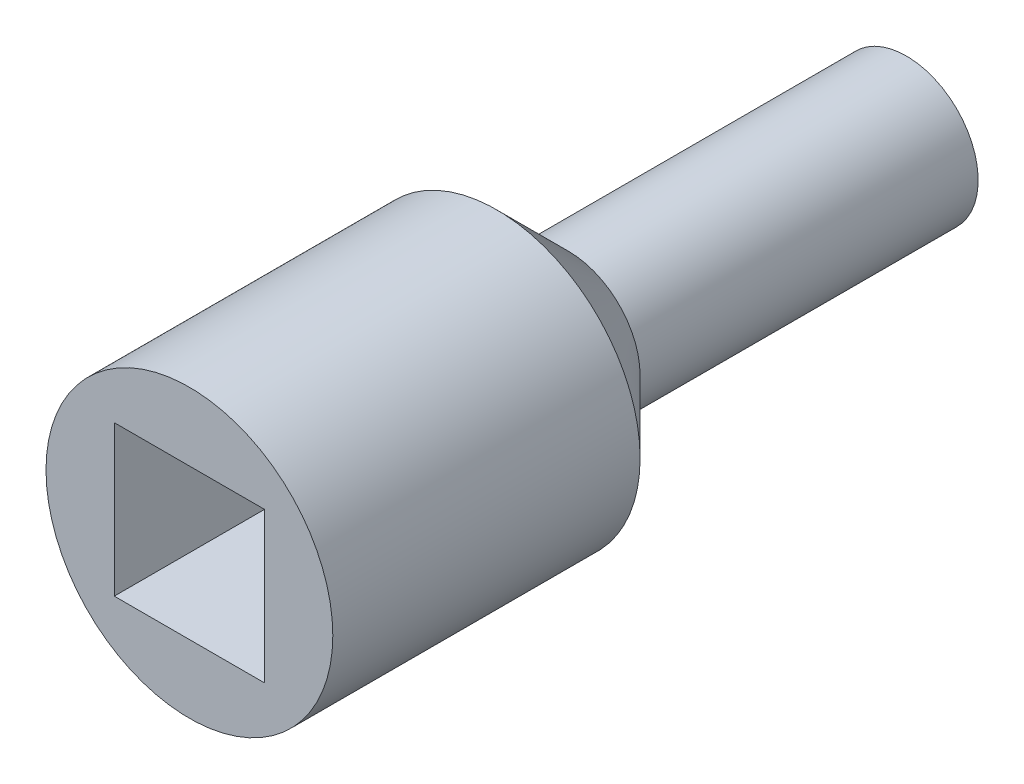
ISO-10303-21;
HEADER;
FILE_DESCRIPTION(('STEP AP214'),'2;1');
FILE_NAME('part.step','',(''),(''),'','','');
FILE_SCHEMA(('AUTOMOTIVE_DESIGN { 1 0 10303 214 1 1 1 1 }'));
ENDSEC;
DATA;
#1=APPLICATION_CONTEXT('core data for automotive mechanical design processes');
#2=APPLICATION_PROTOCOL_DEFINITION('international standard','automotive_design',2000,#1);
#3=PRODUCT_CONTEXT('',#1,'mechanical');
#4=PRODUCT('Part','Part','',(#3));
#5=PRODUCT_RELATED_PRODUCT_CATEGORY('part','',(#4));
#6=PRODUCT_DEFINITION_FORMATION('','',#4);
#7=PRODUCT_DEFINITION_CONTEXT('part definition',#1,'design');
#8=PRODUCT_DEFINITION('design','',#6,#7);
#9=PRODUCT_DEFINITION_SHAPE('','',#8);
#10=(LENGTH_UNIT() NAMED_UNIT(*) SI_UNIT(.MILLI.,.METRE.));
#11=(NAMED_UNIT(*) PLANE_ANGLE_UNIT() SI_UNIT($,.RADIAN.));
#12=(NAMED_UNIT(*) SI_UNIT($,.STERADIAN.) SOLID_ANGLE_UNIT());
#13=UNCERTAINTY_MEASURE_WITH_UNIT(LENGTH_MEASURE(1.E-05),#10,'distance_accuracy_value','');
#14=(GEOMETRIC_REPRESENTATION_CONTEXT(3) GLOBAL_UNCERTAINTY_ASSIGNED_CONTEXT((#13)) GLOBAL_UNIT_ASSIGNED_CONTEXT((#10,
#11,#12)) REPRESENTATION_CONTEXT('',''));
#15=CARTESIAN_POINT('',(0.,0.,0.));
#16=DIRECTION('',(0.,0.,1.));
#17=DIRECTION('',(1.,0.,0.));
#18=AXIS2_PLACEMENT_3D('',#15,#16,#17);
#19=CARTESIAN_POINT('',(0.,0.,10.));
#20=DIRECTION('',(0.,0.,-1.));
#21=DIRECTION('',(-1.,0.,0.));
#22=AXIS2_PLACEMENT_3D('',#19,#20,#21);
#23=CYLINDRICAL_SURFACE('',#22,3.5);
#24=CARTESIAN_POINT('',(0.,0.,17.5));
#25=DIRECTION('',(0.,0.,1.));
#26=DIRECTION('',(1.,0.,0.));
#27=AXIS2_PLACEMENT_3D('',#24,#25,#26);
#28=CIRCLE('',#27,3.5);
#29=CARTESIAN_POINT('',(3.5,0.,17.5));
#30=VERTEX_POINT('',#29);
#31=EDGE_CURVE('E11',#30,#30,#28,.T.);
#32=ORIENTED_EDGE('',*,*,#31,.F.);
#33=EDGE_LOOP('',(#32));
#34=FACE_BOUND('',#33,.T.);
#35=CARTESIAN_POINT('',(0.,0.,10.));
#36=DIRECTION('',(0.,0.,-1.));
#37=DIRECTION('',(-1.,0.,0.));
#38=AXIS2_PLACEMENT_3D('',#35,#36,#37);
#39=CIRCLE('',#38,3.5);
#40=CARTESIAN_POINT('',(-3.5,0.,10.));
#41=VERTEX_POINT('',#40);
#42=EDGE_CURVE('E109',#41,#41,#39,.T.);
#43=ORIENTED_EDGE('',*,*,#42,.F.);
#44=EDGE_LOOP('',(#43));
#45=FACE_BOUND('',#44,.T.);
#46=ADVANCED_FACE('F39',(#34,#45),#23,.T.);
#47=CARTESIAN_POINT('',(0.,0.,17.5));
#48=DIRECTION('',(0.,0.,1.));
#49=DIRECTION('',(1.,0.,0.));
#50=AXIS2_PLACEMENT_3D('',#47,#48,#49);
#51=PLANE('',#50);
#52=DIRECTION('',(0.,1.,0.));
#53=VECTOR('',#52,1.);
#54=CARTESIAN_POINT('',(1.833798025,-1.833784525,17.5));
#55=LINE('',#54,#53);
#56=CARTESIAN_POINT('',(1.833798025,-1.833784525,17.5));
#57=VERTEX_POINT('',#56);
#58=CARTESIAN_POINT('',(1.833798025,1.833784525,17.5));
#59=VERTEX_POINT('',#58);
#60=EDGE_CURVE('E53',#57,#59,#55,.T.);
#61=ORIENTED_EDGE('',*,*,#60,.F.);
#62=DIRECTION('',(1.,0.,0.));
#63=VECTOR('',#62,1.);
#64=CARTESIAN_POINT('',(-1.833798025,-1.833784525,17.5));
#65=LINE('',#64,#63);
#66=CARTESIAN_POINT('',(-1.833798025,-1.833784525,17.5));
#67=VERTEX_POINT('',#66);
#68=EDGE_CURVE('E103',#67,#57,#65,.T.);
#69=ORIENTED_EDGE('',*,*,#68,.F.);
#70=DIRECTION('',(0.,-1.,0.));
#71=VECTOR('',#70,1.);
#72=CARTESIAN_POINT('',(-1.833798025,-1.833784525,17.5));
#73=LINE('',#72,#71);
#74=CARTESIAN_POINT('',(-1.833798025,1.833784525,17.5));
#75=VERTEX_POINT('',#74);
#76=EDGE_CURVE('E111',#75,#67,#73,.T.);
#77=ORIENTED_EDGE('',*,*,#76,.F.);
#78=DIRECTION('',(-1.,0.,0.));
#79=VECTOR('',#78,1.);
#80=CARTESIAN_POINT('',(-1.833798025,1.833784525,17.5));
#81=LINE('',#80,#79);
#82=EDGE_CURVE('E87',#59,#75,#81,.T.);
#83=ORIENTED_EDGE('',*,*,#82,.F.);
#84=EDGE_LOOP('',(#61,#69,#77,#83));
#85=FACE_BOUND('',#84,.T.);
#86=ORIENTED_EDGE('',*,*,#31,.T.);
#87=EDGE_LOOP('',(#86));
#88=FACE_BOUND('',#87,.T.);
#89=ADVANCED_FACE('F116',(#85,#88),#51,.T.);
#90=CARTESIAN_POINT('',(1.833798025,-1.833784525,12.5));
#91=DIRECTION('',(1.,0.,0.));
#92=DIRECTION('',(0.,0.,-1.));
#93=AXIS2_PLACEMENT_3D('',#90,#91,#92);
#94=PLANE('',#93);
#95=ORIENTED_EDGE('',*,*,#60,.T.);
#96=DIRECTION('',(0.,0.,1.));
#97=VECTOR('',#96,1.);
#98=CARTESIAN_POINT('',(1.833798025,1.833784525,12.5));
#99=LINE('',#98,#97);
#100=CARTESIAN_POINT('',(1.833798025,1.833784525,12.5));
#101=VERTEX_POINT('',#100);
#102=EDGE_CURVE('E75',#101,#59,#99,.T.);
#103=ORIENTED_EDGE('',*,*,#102,.F.);
#104=DIRECTION('',(0.,1.,0.));
#105=VECTOR('',#104,1.);
#106=CARTESIAN_POINT('',(1.833798025,-1.833784525,12.5));
#107=LINE('',#106,#105);
#108=CARTESIAN_POINT('',(1.833798025,-1.833784525,12.5));
#109=VERTEX_POINT('',#108);
#110=EDGE_CURVE('E101',#109,#101,#107,.T.);
#111=ORIENTED_EDGE('',*,*,#110,.F.);
#112=DIRECTION('',(0.,0.,1.));
#113=VECTOR('',#112,1.);
#114=CARTESIAN_POINT('',(1.833798025,-1.833784525,12.5));
#115=LINE('',#114,#113);
#116=EDGE_CURVE('E46',#109,#57,#115,.T.);
#117=ORIENTED_EDGE('',*,*,#116,.T.);
#118=EDGE_LOOP('',(#95,#103,#111,#117));
#119=FACE_BOUND('',#118,.T.);
#120=ADVANCED_FACE('F121',(#119),#94,.F.);
#121=CARTESIAN_POINT('',(-1.833798025,-1.833784525,12.5));
#122=DIRECTION('',(0.,-1.,0.));
#123=DIRECTION('',(0.,0.,-1.));
#124=AXIS2_PLACEMENT_3D('',#121,#122,#123);
#125=PLANE('',#124);
#126=ORIENTED_EDGE('',*,*,#68,.T.);
#127=ORIENTED_EDGE('',*,*,#116,.F.);
#128=DIRECTION('',(1.,0.,0.));
#129=VECTOR('',#128,1.);
#130=CARTESIAN_POINT('',(-1.833798025,-1.833784525,12.5));
#131=LINE('',#130,#129);
#132=CARTESIAN_POINT('',(-1.833798025,-1.833784525,12.5));
#133=VERTEX_POINT('',#132);
#134=EDGE_CURVE('E98',#133,#109,#131,.T.);
#135=ORIENTED_EDGE('',*,*,#134,.F.);
#136=DIRECTION('',(0.,0.,1.));
#137=VECTOR('',#136,1.);
#138=CARTESIAN_POINT('',(-1.833798025,-1.833784525,12.5));
#139=LINE('',#138,#137);
#140=EDGE_CURVE('E91',#133,#67,#139,.T.);
#141=ORIENTED_EDGE('',*,*,#140,.T.);
#142=EDGE_LOOP('',(#126,#127,#135,#141));
#143=FACE_BOUND('',#142,.T.);
#144=ADVANCED_FACE('F119',(#143),#125,.F.);
#145=CARTESIAN_POINT('',(-1.833798025,-1.833784525,12.5));
#146=DIRECTION('',(-1.,0.,0.));
#147=DIRECTION('',(0.,0.,1.));
#148=AXIS2_PLACEMENT_3D('',#145,#146,#147);
#149=PLANE('',#148);
#150=ORIENTED_EDGE('',*,*,#76,.T.);
#151=ORIENTED_EDGE('',*,*,#140,.F.);
#152=DIRECTION('',(0.,-1.,0.));
#153=VECTOR('',#152,1.);
#154=CARTESIAN_POINT('',(-1.833798025,-1.833784525,12.5));
#155=LINE('',#154,#153);
#156=CARTESIAN_POINT('',(-1.833798025,1.833784525,12.5));
#157=VERTEX_POINT('',#156);
#158=EDGE_CURVE('E94',#157,#133,#155,.T.);
#159=ORIENTED_EDGE('',*,*,#158,.F.);
#160=DIRECTION('',(0.,0.,1.));
#161=VECTOR('',#160,1.);
#162=CARTESIAN_POINT('',(-1.833798025,1.833784525,12.5));
#163=LINE('',#162,#161);
#164=EDGE_CURVE('E80',#157,#75,#163,.T.);
#165=ORIENTED_EDGE('',*,*,#164,.T.);
#166=EDGE_LOOP('',(#150,#151,#159,#165));
#167=FACE_BOUND('',#166,.T.);
#168=ADVANCED_FACE('F95',(#167),#149,.F.);
#169=CARTESIAN_POINT('',(-1.833798025,1.833784525,12.5));
#170=DIRECTION('',(0.,1.,0.));
#171=DIRECTION('',(0.,0.,1.));
#172=AXIS2_PLACEMENT_3D('',#169,#170,#171);
#173=PLANE('',#172);
#174=ORIENTED_EDGE('',*,*,#82,.T.);
#175=ORIENTED_EDGE('',*,*,#164,.F.);
#176=DIRECTION('',(-1.,0.,0.));
#177=VECTOR('',#176,1.);
#178=CARTESIAN_POINT('',(-1.833798025,1.833784525,12.5));
#179=LINE('',#178,#177);
#180=EDGE_CURVE('E84',#101,#157,#179,.T.);
#181=ORIENTED_EDGE('',*,*,#180,.F.);
#182=ORIENTED_EDGE('',*,*,#102,.T.);
#183=EDGE_LOOP('',(#174,#175,#181,#182));
#184=FACE_BOUND('',#183,.T.);
#185=ADVANCED_FACE('F82',(#184),#173,.F.);
#186=CARTESIAN_POINT('',(0.,0.,12.5));
#187=DIRECTION('',(0.,0.,-1.));
#188=DIRECTION('',(-1.,0.,0.));
#189=AXIS2_PLACEMENT_3D('',#186,#187,#188);
#190=PLANE('',#189);
#191=ORIENTED_EDGE('',*,*,#110,.T.);
#192=ORIENTED_EDGE('',*,*,#180,.T.);
#193=ORIENTED_EDGE('',*,*,#158,.T.);
#194=ORIENTED_EDGE('',*,*,#134,.T.);
#195=EDGE_LOOP('',(#191,#192,#193,#194));
#196=FACE_BOUND('',#195,.T.);
#197=ADVANCED_FACE('F100',(#196),#190,.F.);
#198=CARTESIAN_POINT('',(0.,0.,8.25));
#199=DIRECTION('',(0.,0.,1.));
#200=DIRECTION('',(1.,0.,0.));
#201=AXIS2_PLACEMENT_3D('',#198,#199,#200);
#202=CONICAL_SURFACE('',#201,1.75,0.785398163397448);
#203=ORIENTED_EDGE('',*,*,#42,.T.);
#204=EDGE_LOOP('',(#203));
#205=FACE_BOUND('',#204,.T.);
#206=CARTESIAN_POINT('',(0.,0.,8.25));
#207=DIRECTION('',(0.,0.,1.));
#208=DIRECTION('',(1.,0.,0.));
#209=AXIS2_PLACEMENT_3D('',#206,#207,#208);
#210=CIRCLE('',#209,1.75);
#211=CARTESIAN_POINT('',(1.75,0.,8.25));
#212=VERTEX_POINT('',#211);
#213=EDGE_CURVE('E146',#212,#212,#210,.T.);
#214=ORIENTED_EDGE('',*,*,#213,.T.);
#215=EDGE_LOOP('',(#214));
#216=FACE_BOUND('',#215,.T.);
#217=ADVANCED_FACE('F151',(#205,#216),#202,.T.);
#218=CARTESIAN_POINT('',(0.,0.,0.));
#219=DIRECTION('',(0.,0.,-1.));
#220=DIRECTION('',(-1.,0.,0.));
#221=AXIS2_PLACEMENT_3D('',#218,#219,#220);
#222=PLANE('',#221);
#223=CARTESIAN_POINT('',(0.,0.,0.));
#224=DIRECTION('',(0.,0.,-1.));
#225=DIRECTION('',(-1.,0.,0.));
#226=AXIS2_PLACEMENT_3D('',#223,#224,#225);
#227=CIRCLE('',#226,1.75);
#228=CARTESIAN_POINT('',(-1.75,0.,0.));
#229=VERTEX_POINT('',#228);
#230=EDGE_CURVE('E143',#229,#229,#227,.T.);
#231=ORIENTED_EDGE('',*,*,#230,.T.);
#232=EDGE_LOOP('',(#231));
#233=FACE_BOUND('',#232,.T.);
#234=ADVANCED_FACE('F155',(#233),#222,.T.);
#235=CARTESIAN_POINT('',(0.,0.,10.));
#236=DIRECTION('',(0.,0.,-1.));
#237=DIRECTION('',(-1.,0.,0.));
#238=AXIS2_PLACEMENT_3D('',#235,#236,#237);
#239=CYLINDRICAL_SURFACE('',#238,1.75);
#240=ORIENTED_EDGE('',*,*,#230,.F.);
#241=EDGE_LOOP('',(#240));
#242=FACE_BOUND('',#241,.T.);
#243=ORIENTED_EDGE('',*,*,#213,.F.);
#244=EDGE_LOOP('',(#243));
#245=FACE_BOUND('',#244,.T.);
#246=ADVANCED_FACE('F153',(#242,#245),#239,.T.);
#247=CLOSED_SHELL('',(#46,#89,#120,#144,#168,#185,#197,#217,#234,#246));
#248=MANIFOLD_SOLID_BREP('B2',#247);
#249=ADVANCED_BREP_SHAPE_REPRESENTATION('',(#18,#248),#14);
#250=SHAPE_DEFINITION_REPRESENTATION(#9,#249);
ENDSEC;
END-ISO-10303-21;
